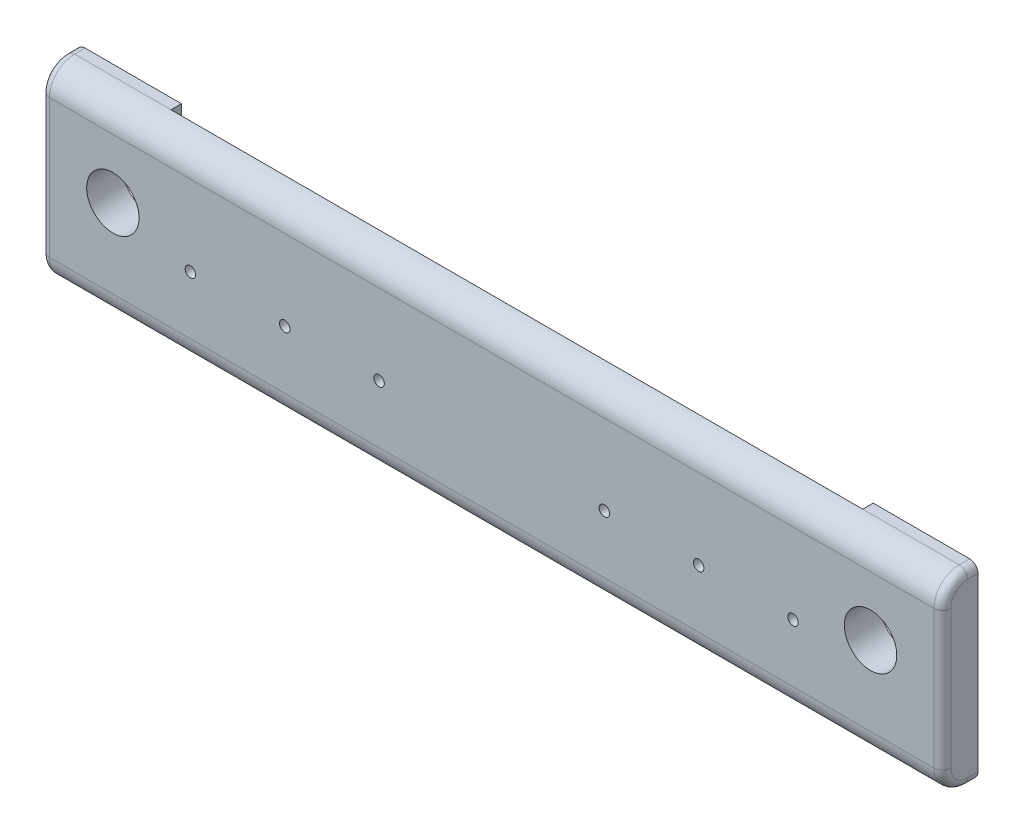
ISO-10303-21;
HEADER;
FILE_DESCRIPTION(('STEP AP214'),'2;1');
FILE_NAME('part.step','',(''),(''),'','','');
FILE_SCHEMA(('AUTOMOTIVE_DESIGN { 1 0 10303 214 1 1 1 1 }'));
ENDSEC;
DATA;
#1=APPLICATION_CONTEXT('core data for automotive mechanical design processes');
#2=APPLICATION_PROTOCOL_DEFINITION('international standard','automotive_design',2000,#1);
#3=PRODUCT_CONTEXT('',#1,'mechanical');
#4=PRODUCT('Part','Part','',(#3));
#5=PRODUCT_RELATED_PRODUCT_CATEGORY('part','',(#4));
#6=PRODUCT_DEFINITION_FORMATION('','',#4);
#7=PRODUCT_DEFINITION_CONTEXT('part definition',#1,'design');
#8=PRODUCT_DEFINITION('design','',#6,#7);
#9=PRODUCT_DEFINITION_SHAPE('','',#8);
#10=(LENGTH_UNIT() NAMED_UNIT(*) SI_UNIT(.MILLI.,.METRE.));
#11=(NAMED_UNIT(*) PLANE_ANGLE_UNIT() SI_UNIT($,.RADIAN.));
#12=(NAMED_UNIT(*) SI_UNIT($,.STERADIAN.) SOLID_ANGLE_UNIT());
#13=UNCERTAINTY_MEASURE_WITH_UNIT(LENGTH_MEASURE(1.E-05),#10,'distance_accuracy_value','');
#14=(GEOMETRIC_REPRESENTATION_CONTEXT(3) GLOBAL_UNCERTAINTY_ASSIGNED_CONTEXT((#13)) GLOBAL_UNIT_ASSIGNED_CONTEXT((#10,
#11,#12)) REPRESENTATION_CONTEXT('',''));
#15=CARTESIAN_POINT('',(0.,0.,0.));
#16=DIRECTION('',(0.,0.,1.));
#17=DIRECTION('',(1.,0.,0.));
#18=AXIS2_PLACEMENT_3D('',#15,#16,#17);
#19=CARTESIAN_POINT('',(-21.5,-4.5,1.2));
#20=DIRECTION('',(0.,1.,0.));
#21=DIRECTION('',(0.,0.,1.));
#22=AXIS2_PLACEMENT_3D('',#19,#20,#21);
#23=PLANE('',#22);
#24=DIRECTION('',(-1.,0.,0.));
#25=VECTOR('',#24,1.);
#26=CARTESIAN_POINT('',(21.5,-4.5,-0.5));
#27=LINE('',#26,#25);
#28=CARTESIAN_POINT('',(21.1,-4.5,-0.5));
#29=VERTEX_POINT('',#28);
#30=CARTESIAN_POINT('',(16.5,-4.5,-0.5));
#31=VERTEX_POINT('',#30);
#32=EDGE_CURVE('E148',#29,#31,#27,.T.);
#33=ORIENTED_EDGE('',*,*,#32,.F.);
#34=DIRECTION('',(0.,0.,-1.));
#35=VECTOR('',#34,1.);
#36=CARTESIAN_POINT('',(21.1,-4.5,1.2));
#37=LINE('',#36,#35);
#38=CARTESIAN_POINT('',(21.1,-4.5,0.));
#39=VERTEX_POINT('',#38);
#40=EDGE_CURVE('E264',#29,#39,#37,.F.);
#41=ORIENTED_EDGE('',*,*,#40,.T.);
#42=DIRECTION('',(1.,0.,0.));
#43=VECTOR('',#42,1.);
#44=CARTESIAN_POINT('',(-21.5,-4.5,0.));
#45=LINE('',#44,#43);
#46=CARTESIAN_POINT('',(16.5,-4.5,0.));
#47=VERTEX_POINT('',#46);
#48=EDGE_CURVE('E164',#39,#47,#45,.F.);
#49=ORIENTED_EDGE('',*,*,#48,.T.);
#50=DIRECTION('',(0.,0.,1.));
#51=VECTOR('',#50,1.);
#52=CARTESIAN_POINT('',(16.5,-4.5,-0.5));
#53=LINE('',#52,#51);
#54=EDGE_CURVE('E162',#31,#47,#53,.T.);
#55=ORIENTED_EDGE('',*,*,#54,.F.);
#56=EDGE_LOOP('',(#33,#41,#49,#55));
#57=FACE_BOUND('',#56,.T.);
#58=ADVANCED_FACE('F35',(#57),#23,.F.);
#59=CARTESIAN_POINT('',(-21.5,4.5,1.2));
#60=DIRECTION('',(0.,-1.,0.));
#61=DIRECTION('',(0.,0.,-1.));
#62=AXIS2_PLACEMENT_3D('',#59,#60,#61);
#63=PLANE('',#62);
#64=DIRECTION('',(1.,0.,0.));
#65=VECTOR('',#64,1.);
#66=CARTESIAN_POINT('',(-21.5,4.5,-0.5));
#67=LINE('',#66,#65);
#68=CARTESIAN_POINT('',(-21.1,4.5,-0.5));
#69=VERTEX_POINT('',#68);
#70=CARTESIAN_POINT('',(-16.5,4.5,-0.5));
#71=VERTEX_POINT('',#70);
#72=EDGE_CURVE('E185',#69,#71,#67,.T.);
#73=ORIENTED_EDGE('',*,*,#72,.F.);
#74=DIRECTION('',(0.,0.,-1.));
#75=VECTOR('',#74,1.);
#76=CARTESIAN_POINT('',(-21.1,4.5,1.2));
#77=LINE('',#76,#75);
#78=CARTESIAN_POINT('',(-21.1,4.5,0.));
#79=VERTEX_POINT('',#78);
#80=EDGE_CURVE('E228',#69,#79,#77,.F.);
#81=ORIENTED_EDGE('',*,*,#80,.T.);
#82=DIRECTION('',(-1.,0.,0.));
#83=VECTOR('',#82,1.);
#84=CARTESIAN_POINT('',(-21.5,4.5,0.));
#85=LINE('',#84,#83);
#86=CARTESIAN_POINT('',(-16.5,4.5,0.));
#87=VERTEX_POINT('',#86);
#88=EDGE_CURVE('E218',#79,#87,#85,.F.);
#89=ORIENTED_EDGE('',*,*,#88,.T.);
#90=DIRECTION('',(0.,0.,1.));
#91=VECTOR('',#90,1.);
#92=CARTESIAN_POINT('',(-16.5,4.5,-0.5));
#93=LINE('',#92,#91);
#94=EDGE_CURVE('E204',#71,#87,#93,.T.);
#95=ORIENTED_EDGE('',*,*,#94,.F.);
#96=EDGE_LOOP('',(#73,#81,#89,#95));
#97=FACE_BOUND('',#96,.T.);
#98=ADVANCED_FACE('F441',(#97),#63,.F.);
#99=CARTESIAN_POINT('',(0.,0.,0.));
#100=DIRECTION('',(0.,0.,-1.));
#101=DIRECTION('',(-1.,0.,0.));
#102=AXIS2_PLACEMENT_3D('',#99,#100,#101);
#103=PLANE('',#102);
#104=CARTESIAN_POINT('',(5.375,-0.529813205299434,0.));
#105=DIRECTION('',(0.,0.,-1.));
#106=DIRECTION('',(-1.,0.,0.));
#107=AXIS2_PLACEMENT_3D('',#104,#105,#106);
#108=CIRCLE('',#107,0.249999999999999);
#109=CARTESIAN_POINT('',(5.125,-0.529813205299434,0.));
#110=VERTEX_POINT('',#109);
#111=EDGE_CURVE('E337',#110,#110,#108,.T.);
#112=ORIENTED_EDGE('',*,*,#111,.F.);
#113=EDGE_LOOP('',(#112));
#114=FACE_BOUND('',#113,.T.);
#115=CARTESIAN_POINT('',(9.875,-0.529813205299434,0.));
#116=DIRECTION('',(0.,0.,-1.));
#117=DIRECTION('',(-1.,0.,0.));
#118=AXIS2_PLACEMENT_3D('',#115,#116,#117);
#119=CIRCLE('',#118,0.25);
#120=CARTESIAN_POINT('',(9.625,-0.529813205299434,0.));
#121=VERTEX_POINT('',#120);
#122=EDGE_CURVE('E331',#121,#121,#119,.T.);
#123=ORIENTED_EDGE('',*,*,#122,.F.);
#124=EDGE_LOOP('',(#123));
#125=FACE_BOUND('',#124,.T.);
#126=CARTESIAN_POINT('',(14.375,-0.529813205299434,0.));
#127=DIRECTION('',(0.,0.,-1.));
#128=DIRECTION('',(-1.,0.,0.));
#129=AXIS2_PLACEMENT_3D('',#126,#127,#128);
#130=CIRCLE('',#129,0.25);
#131=CARTESIAN_POINT('',(14.125,-0.529813205299434,0.));
#132=VERTEX_POINT('',#131);
#133=EDGE_CURVE('E325',#132,#132,#130,.T.);
#134=ORIENTED_EDGE('',*,*,#133,.F.);
#135=EDGE_LOOP('',(#134));
#136=FACE_BOUND('',#135,.T.);
#137=CARTESIAN_POINT('',(-5.375,-0.529813205299434,0.));
#138=DIRECTION('',(0.,0.,-1.));
#139=DIRECTION('',(-1.,0.,0.));
#140=AXIS2_PLACEMENT_3D('',#137,#138,#139);
#141=CIRCLE('',#140,0.25);
#142=CARTESIAN_POINT('',(-5.625,-0.529813205299434,0.));
#143=VERTEX_POINT('',#142);
#144=EDGE_CURVE('E319',#143,#143,#141,.T.);
#145=ORIENTED_EDGE('',*,*,#144,.F.);
#146=EDGE_LOOP('',(#145));
#147=FACE_BOUND('',#146,.T.);
#148=CARTESIAN_POINT('',(-9.875,-0.529813205299434,0.));
#149=DIRECTION('',(0.,0.,-1.));
#150=DIRECTION('',(-1.,0.,0.));
#151=AXIS2_PLACEMENT_3D('',#148,#149,#150);
#152=CIRCLE('',#151,0.25);
#153=CARTESIAN_POINT('',(-10.125,-0.529813205299434,0.));
#154=VERTEX_POINT('',#153);
#155=EDGE_CURVE('E313',#154,#154,#152,.T.);
#156=ORIENTED_EDGE('',*,*,#155,.F.);
#157=EDGE_LOOP('',(#156));
#158=FACE_BOUND('',#157,.T.);
#159=CARTESIAN_POINT('',(-14.375,-0.529813205299434,0.));
#160=DIRECTION('',(0.,0.,-1.));
#161=DIRECTION('',(-1.,0.,0.));
#162=AXIS2_PLACEMENT_3D('',#159,#160,#161);
#163=CIRCLE('',#162,0.25);
#164=CARTESIAN_POINT('',(-14.625,-0.529813205299434,0.));
#165=VERTEX_POINT('',#164);
#166=EDGE_CURVE('E275',#165,#165,#163,.T.);
#167=ORIENTED_EDGE('',*,*,#166,.F.);
#168=EDGE_LOOP('',(#167));
#169=FACE_BOUND('',#168,.T.);
#170=DIRECTION('',(-1.,0.,0.));
#171=VECTOR('',#170,1.);
#172=CARTESIAN_POINT('',(-21.5,4.5,0.));
#173=LINE('',#172,#171);
#174=CARTESIAN_POINT('',(16.5,4.5,0.));
#175=VERTEX_POINT('',#174);
#176=EDGE_CURVE('E209',#175,#87,#173,.T.);
#177=ORIENTED_EDGE('',*,*,#176,.F.);
#178=DIRECTION('',(0.,1.,0.));
#179=VECTOR('',#178,1.);
#180=CARTESIAN_POINT('',(16.5,4.5,0.));
#181=LINE('',#180,#179);
#182=EDGE_CURVE('E178',#47,#175,#181,.T.);
#183=ORIENTED_EDGE('',*,*,#182,.F.);
#184=DIRECTION('',(1.,0.,0.));
#185=VECTOR('',#184,1.);
#186=CARTESIAN_POINT('',(-21.5,-4.5,0.));
#187=LINE('',#186,#185);
#188=CARTESIAN_POINT('',(-16.5,-4.5,0.));
#189=VERTEX_POINT('',#188);
#190=EDGE_CURVE('E201',#189,#47,#187,.T.);
#191=ORIENTED_EDGE('',*,*,#190,.F.);
#192=DIRECTION('',(0.,-1.,0.));
#193=VECTOR('',#192,1.);
#194=CARTESIAN_POINT('',(-16.5,4.5,0.));
#195=LINE('',#194,#193);
#196=EDGE_CURVE('E168',#87,#189,#195,.T.);
#197=ORIENTED_EDGE('',*,*,#196,.F.);
#198=EDGE_LOOP('',(#177,#183,#191,#197));
#199=FACE_BOUND('',#198,.T.);
#200=ADVANCED_FACE('F426',(#114,#125,#136,#147,#158,#169,#199),#103,.T.);
#201=CARTESIAN_POINT('',(21.5,-4.5,1.2));
#202=DIRECTION('',(-1.,0.,0.));
#203=DIRECTION('',(0.,0.,1.));
#204=AXIS2_PLACEMENT_3D('',#201,#202,#203);
#205=PLANE('',#204);
#206=CARTESIAN_POINT('',(21.5,-3.3,0.));
#207=DIRECTION('',(-1.,0.,0.));
#208=DIRECTION('',(0.,0.,1.));
#209=AXIS2_PLACEMENT_3D('',#206,#207,#208);
#210=CIRCLE('',#209,0.8);
#211=CARTESIAN_POINT('',(21.5,-3.3,0.8));
#212=VERTEX_POINT('',#211);
#213=CARTESIAN_POINT('',(21.5,-4.1,0.));
#214=VERTEX_POINT('',#213);
#215=EDGE_CURVE('E256',#212,#214,#210,.F.);
#216=ORIENTED_EDGE('',*,*,#215,.T.);
#217=DIRECTION('',(0.,0.,-1.));
#218=VECTOR('',#217,1.);
#219=CARTESIAN_POINT('',(21.5,-4.1,1.2));
#220=LINE('',#219,#218);
#221=CARTESIAN_POINT('',(21.5,-4.1,-0.5));
#222=VERTEX_POINT('',#221);
#223=EDGE_CURVE('E258',#214,#222,#220,.T.);
#224=ORIENTED_EDGE('',*,*,#223,.T.);
#225=DIRECTION('',(0.,-1.,0.));
#226=VECTOR('',#225,1.);
#227=CARTESIAN_POINT('',(21.5,4.5,-0.5));
#228=LINE('',#227,#226);
#229=CARTESIAN_POINT('',(21.5,4.1,-0.5));
#230=VERTEX_POINT('',#229);
#231=EDGE_CURVE('E159',#230,#222,#228,.T.);
#232=ORIENTED_EDGE('',*,*,#231,.F.);
#233=DIRECTION('',(0.,0.,-1.));
#234=VECTOR('',#233,1.);
#235=CARTESIAN_POINT('',(21.5,4.1,1.2));
#236=LINE('',#235,#234);
#237=CARTESIAN_POINT('',(21.5,4.1,0.));
#238=VERTEX_POINT('',#237);
#239=EDGE_CURVE('E254',#230,#238,#236,.F.);
#240=ORIENTED_EDGE('',*,*,#239,.T.);
#241=CARTESIAN_POINT('',(21.5,3.3,0.));
#242=DIRECTION('',(-1.,0.,0.));
#243=DIRECTION('',(0.,0.,1.));
#244=AXIS2_PLACEMENT_3D('',#241,#242,#243);
#245=CIRCLE('',#244,0.8);
#246=CARTESIAN_POINT('',(21.5,3.3,0.8));
#247=VERTEX_POINT('',#246);
#248=EDGE_CURVE('E252',#238,#247,#245,.F.);
#249=ORIENTED_EDGE('',*,*,#248,.T.);
#250=DIRECTION('',(0.,1.,0.));
#251=VECTOR('',#250,1.);
#252=CARTESIAN_POINT('',(21.5,-4.5,0.8));
#253=LINE('',#252,#251);
#254=EDGE_CURVE('E237',#247,#212,#253,.F.);
#255=ORIENTED_EDGE('',*,*,#254,.T.);
#256=EDGE_LOOP('',(#216,#224,#232,#240,#249,#255));
#257=FACE_BOUND('',#256,.T.);
#258=ADVANCED_FACE('F295',(#257),#205,.F.);
#259=DIRECTION('',(-1.,0.,0.));
#260=VECTOR('',#259,1.);
#261=CARTESIAN_POINT('',(-21.5,4.5,0.));
#262=LINE('',#261,#260);
#263=CARTESIAN_POINT('',(21.1,4.5,0.));
#264=VERTEX_POINT('',#263);
#265=EDGE_CURVE('E216',#175,#264,#262,.F.);
#266=ORIENTED_EDGE('',*,*,#265,.T.);
#267=DIRECTION('',(0.,0.,-1.));
#268=VECTOR('',#267,1.);
#269=CARTESIAN_POINT('',(21.1,4.5,1.2));
#270=LINE('',#269,#268);
#271=CARTESIAN_POINT('',(21.1,4.5,-0.5));
#272=VERTEX_POINT('',#271);
#273=EDGE_CURVE('E268',#264,#272,#270,.T.);
#274=ORIENTED_EDGE('',*,*,#273,.T.);
#275=DIRECTION('',(1.,0.,0.));
#276=VECTOR('',#275,1.);
#277=CARTESIAN_POINT('',(21.5,4.5,-0.5));
#278=LINE('',#277,#276);
#279=CARTESIAN_POINT('',(16.5,4.5,-0.5));
#280=VERTEX_POINT('',#279);
#281=EDGE_CURVE('E173',#280,#272,#278,.T.);
#282=ORIENTED_EDGE('',*,*,#281,.F.);
#283=DIRECTION('',(0.,0.,1.));
#284=VECTOR('',#283,1.);
#285=CARTESIAN_POINT('',(16.5,4.5,-0.5));
#286=LINE('',#285,#284);
#287=EDGE_CURVE('E169',#280,#175,#286,.T.);
#288=ORIENTED_EDGE('',*,*,#287,.T.);
#289=EDGE_LOOP('',(#266,#274,#282,#288));
#290=FACE_BOUND('',#289,.T.);
#291=ADVANCED_FACE('F292',(#290),#63,.F.);
#292=CARTESIAN_POINT('',(-21.5,-4.5,1.2));
#293=DIRECTION('',(1.,0.,0.));
#294=DIRECTION('',(0.,0.,-1.));
#295=AXIS2_PLACEMENT_3D('',#292,#293,#294);
#296=PLANE('',#295);
#297=DIRECTION('',(0.,1.,0.));
#298=VECTOR('',#297,1.);
#299=CARTESIAN_POINT('',(-21.5,4.5,-0.5));
#300=LINE('',#299,#298);
#301=CARTESIAN_POINT('',(-21.5,-4.1,-0.5));
#302=VERTEX_POINT('',#301);
#303=CARTESIAN_POINT('',(-21.5,4.1,-0.5));
#304=VERTEX_POINT('',#303);
#305=EDGE_CURVE('E182',#302,#304,#300,.T.);
#306=ORIENTED_EDGE('',*,*,#305,.F.);
#307=DIRECTION('',(0.,0.,-1.));
#308=VECTOR('',#307,1.);
#309=CARTESIAN_POINT('',(-21.5,-4.1,1.2));
#310=LINE('',#309,#308);
#311=CARTESIAN_POINT('',(-21.5,-4.1,0.));
#312=VERTEX_POINT('',#311);
#313=EDGE_CURVE('E226',#302,#312,#310,.F.);
#314=ORIENTED_EDGE('',*,*,#313,.T.);
#315=CARTESIAN_POINT('',(-21.5,-3.3,0.));
#316=DIRECTION('',(1.,0.,0.));
#317=DIRECTION('',(0.,0.,-1.));
#318=AXIS2_PLACEMENT_3D('',#315,#316,#317);
#319=CIRCLE('',#318,0.8);
#320=CARTESIAN_POINT('',(-21.5,-3.3,0.8));
#321=VERTEX_POINT('',#320);
#322=EDGE_CURVE('E394',#312,#321,#319,.F.);
#323=ORIENTED_EDGE('',*,*,#322,.T.);
#324=DIRECTION('',(0.,-1.,0.));
#325=VECTOR('',#324,1.);
#326=CARTESIAN_POINT('',(-21.5,-4.5,0.8));
#327=LINE('',#326,#325);
#328=CARTESIAN_POINT('',(-21.5,3.3,0.8));
#329=VERTEX_POINT('',#328);
#330=EDGE_CURVE('E396',#321,#329,#327,.F.);
#331=ORIENTED_EDGE('',*,*,#330,.T.);
#332=CARTESIAN_POINT('',(-21.5,3.3,0.));
#333=DIRECTION('',(1.,0.,0.));
#334=DIRECTION('',(0.,0.,-1.));
#335=AXIS2_PLACEMENT_3D('',#332,#333,#334);
#336=CIRCLE('',#335,0.8);
#337=CARTESIAN_POINT('',(-21.5,4.1,0.));
#338=VERTEX_POINT('',#337);
#339=EDGE_CURVE('E398',#329,#338,#336,.F.);
#340=ORIENTED_EDGE('',*,*,#339,.T.);
#341=DIRECTION('',(0.,0.,-1.));
#342=VECTOR('',#341,1.);
#343=CARTESIAN_POINT('',(-21.5,4.1,1.2));
#344=LINE('',#343,#342);
#345=EDGE_CURVE('E399',#338,#304,#344,.T.);
#346=ORIENTED_EDGE('',*,*,#345,.T.);
#347=EDGE_LOOP('',(#306,#314,#323,#331,#340,#346));
#348=FACE_BOUND('',#347,.T.);
#349=ADVANCED_FACE('F405',(#348),#296,.F.);
#350=DIRECTION('',(1.,0.,0.));
#351=VECTOR('',#350,1.);
#352=CARTESIAN_POINT('',(-21.5,-4.5,0.));
#353=LINE('',#352,#351);
#354=CARTESIAN_POINT('',(-21.1,-4.5,0.));
#355=VERTEX_POINT('',#354);
#356=EDGE_CURVE('E369',#189,#355,#353,.F.);
#357=ORIENTED_EDGE('',*,*,#356,.T.);
#358=DIRECTION('',(0.,0.,-1.));
#359=VECTOR('',#358,1.);
#360=CARTESIAN_POINT('',(-21.1,-4.5,1.2));
#361=LINE('',#360,#359);
#362=CARTESIAN_POINT('',(-21.1,-4.5,-0.5));
#363=VERTEX_POINT('',#362);
#364=EDGE_CURVE('E382',#355,#363,#361,.T.);
#365=ORIENTED_EDGE('',*,*,#364,.T.);
#366=DIRECTION('',(-1.,0.,0.));
#367=VECTOR('',#366,1.);
#368=CARTESIAN_POINT('',(-21.5,-4.5,-0.5));
#369=LINE('',#368,#367);
#370=CARTESIAN_POINT('',(-16.5,-4.5,-0.5));
#371=VERTEX_POINT('',#370);
#372=EDGE_CURVE('E189',#371,#363,#369,.T.);
#373=ORIENTED_EDGE('',*,*,#372,.F.);
#374=DIRECTION('',(0.,0.,1.));
#375=VECTOR('',#374,1.);
#376=CARTESIAN_POINT('',(-16.5,-4.5,-0.5));
#377=LINE('',#376,#375);
#378=EDGE_CURVE('E192',#371,#189,#377,.T.);
#379=ORIENTED_EDGE('',*,*,#378,.T.);
#380=EDGE_LOOP('',(#357,#365,#373,#379));
#381=FACE_BOUND('',#380,.T.);
#382=ADVANCED_FACE('F350',(#381),#23,.F.);
#383=CARTESIAN_POINT('',(0.,0.,1.2));
#384=DIRECTION('',(0.,0.,-1.));
#385=DIRECTION('',(-1.,0.,0.));
#386=AXIS2_PLACEMENT_3D('',#383,#384,#385);
#387=PLANE('',#386);
#388=CARTESIAN_POINT('',(5.375,-0.529813205299434,1.2));
#389=DIRECTION('',(0.,0.,1.));
#390=DIRECTION('',(1.,0.,0.));
#391=AXIS2_PLACEMENT_3D('',#388,#389,#390);
#392=CIRCLE('',#391,0.249999999999999);
#393=CARTESIAN_POINT('',(5.625,-0.529813205299434,1.2));
#394=VERTEX_POINT('',#393);
#395=EDGE_CURVE('E340',#394,#394,#392,.T.);
#396=ORIENTED_EDGE('',*,*,#395,.F.);
#397=EDGE_LOOP('',(#396));
#398=FACE_BOUND('',#397,.T.);
#399=CARTESIAN_POINT('',(9.875,-0.529813205299434,1.2));
#400=DIRECTION('',(0.,0.,1.));
#401=DIRECTION('',(1.,0.,0.));
#402=AXIS2_PLACEMENT_3D('',#399,#400,#401);
#403=CIRCLE('',#402,0.25);
#404=CARTESIAN_POINT('',(10.125,-0.529813205299434,1.2));
#405=VERTEX_POINT('',#404);
#406=EDGE_CURVE('E334',#405,#405,#403,.T.);
#407=ORIENTED_EDGE('',*,*,#406,.F.);
#408=EDGE_LOOP('',(#407));
#409=FACE_BOUND('',#408,.T.);
#410=CARTESIAN_POINT('',(14.375,-0.529813205299434,1.2));
#411=DIRECTION('',(0.,0.,1.));
#412=DIRECTION('',(1.,0.,0.));
#413=AXIS2_PLACEMENT_3D('',#410,#411,#412);
#414=CIRCLE('',#413,0.25);
#415=CARTESIAN_POINT('',(14.625,-0.529813205299434,1.2));
#416=VERTEX_POINT('',#415);
#417=EDGE_CURVE('E328',#416,#416,#414,.T.);
#418=ORIENTED_EDGE('',*,*,#417,.F.);
#419=EDGE_LOOP('',(#418));
#420=FACE_BOUND('',#419,.T.);
#421=CARTESIAN_POINT('',(-5.375,-0.529813205299434,1.2));
#422=DIRECTION('',(0.,0.,1.));
#423=DIRECTION('',(1.,0.,0.));
#424=AXIS2_PLACEMENT_3D('',#421,#422,#423);
#425=CIRCLE('',#424,0.25);
#426=CARTESIAN_POINT('',(-5.125,-0.529813205299434,1.2));
#427=VERTEX_POINT('',#426);
#428=EDGE_CURVE('E322',#427,#427,#425,.T.);
#429=ORIENTED_EDGE('',*,*,#428,.F.);
#430=EDGE_LOOP('',(#429));
#431=FACE_BOUND('',#430,.T.);
#432=CARTESIAN_POINT('',(-9.875,-0.529813205299434,1.2));
#433=DIRECTION('',(0.,0.,1.));
#434=DIRECTION('',(1.,0.,0.));
#435=AXIS2_PLACEMENT_3D('',#432,#433,#434);
#436=CIRCLE('',#435,0.25);
#437=CARTESIAN_POINT('',(-9.625,-0.529813205299434,1.2));
#438=VERTEX_POINT('',#437);
#439=EDGE_CURVE('E316',#438,#438,#436,.T.);
#440=ORIENTED_EDGE('',*,*,#439,.F.);
#441=EDGE_LOOP('',(#440));
#442=FACE_BOUND('',#441,.T.);
#443=CARTESIAN_POINT('',(-14.375,-0.529813205299434,1.2));
#444=DIRECTION('',(0.,0.,1.));
#445=DIRECTION('',(1.,0.,0.));
#446=AXIS2_PLACEMENT_3D('',#443,#444,#445);
#447=CIRCLE('',#446,0.25);
#448=CARTESIAN_POINT('',(-14.125,-0.529813205299434,1.2));
#449=VERTEX_POINT('',#448);
#450=EDGE_CURVE('E310',#449,#449,#447,.T.);
#451=ORIENTED_EDGE('',*,*,#450,.F.);
#452=EDGE_LOOP('',(#451));
#453=FACE_BOUND('',#452,.T.);
#454=CARTESIAN_POINT('',(-18.075,0.470186794700567,1.2));
#455=DIRECTION('',(0.,0.,-1.));
#456=DIRECTION('',(-1.,0.,0.));
#457=AXIS2_PLACEMENT_3D('',#454,#455,#456);
#458=CIRCLE('',#457,1.25);
#459=CARTESIAN_POINT('',(-19.325,0.470186794700567,1.2));
#460=VERTEX_POINT('',#459);
#461=EDGE_CURVE('E303',#460,#460,#458,.T.);
#462=ORIENTED_EDGE('',*,*,#461,.T.);
#463=EDGE_LOOP('',(#462));
#464=FACE_BOUND('',#463,.T.);
#465=CARTESIAN_POINT('',(18.075,0.470186794700567,1.2));
#466=DIRECTION('',(0.,0.,-1.));
#467=DIRECTION('',(-1.,0.,0.));
#468=AXIS2_PLACEMENT_3D('',#465,#466,#467);
#469=CIRCLE('',#468,1.25);
#470=CARTESIAN_POINT('',(16.825,0.470186794700567,1.2));
#471=VERTEX_POINT('',#470);
#472=EDGE_CURVE('E180',#471,#471,#469,.T.);
#473=ORIENTED_EDGE('',*,*,#472,.T.);
#474=EDGE_LOOP('',(#473));
#475=FACE_BOUND('',#474,.T.);
#476=DIRECTION('',(1.,0.,0.));
#477=VECTOR('',#476,1.);
#478=CARTESIAN_POINT('',(0.,-3.3,1.2));
#479=LINE('',#478,#477);
#480=CARTESIAN_POINT('',(-21.1,-3.3,1.2));
#481=VERTEX_POINT('',#480);
#482=CARTESIAN_POINT('',(21.1,-3.3,1.2));
#483=VERTEX_POINT('',#482);
#484=EDGE_CURVE('E221',#481,#483,#479,.T.);
#485=ORIENTED_EDGE('',*,*,#484,.T.);
#486=DIRECTION('',(0.,1.,0.));
#487=VECTOR('',#486,1.);
#488=CARTESIAN_POINT('',(21.1,0.,1.2));
#489=LINE('',#488,#487);
#490=CARTESIAN_POINT('',(21.1,3.3,1.2));
#491=VERTEX_POINT('',#490);
#492=EDGE_CURVE('E11',#483,#491,#489,.T.);
#493=ORIENTED_EDGE('',*,*,#492,.T.);
#494=DIRECTION('',(-1.,0.,0.));
#495=VECTOR('',#494,1.);
#496=CARTESIAN_POINT('',(0.,3.3,1.2));
#497=LINE('',#496,#495);
#498=CARTESIAN_POINT('',(-21.1,3.3,1.2));
#499=VERTEX_POINT('',#498);
#500=EDGE_CURVE('E214',#491,#499,#497,.T.);
#501=ORIENTED_EDGE('',*,*,#500,.T.);
#502=DIRECTION('',(0.,-1.,0.));
#503=VECTOR('',#502,1.);
#504=CARTESIAN_POINT('',(-21.1,0.,1.2));
#505=LINE('',#504,#503);
#506=EDGE_CURVE('E233',#499,#481,#505,.T.);
#507=ORIENTED_EDGE('',*,*,#506,.T.);
#508=EDGE_LOOP('',(#485,#493,#501,#507));
#509=FACE_BOUND('',#508,.T.);
#510=ADVANCED_FACE('F346',(#398,#409,#420,#431,#442,#453,#464,#475,#509),#387,.F.);
#511=CARTESIAN_POINT('',(-16.5,4.5,-0.5));
#512=DIRECTION('',(-1.,0.,0.));
#513=DIRECTION('',(0.,0.,1.));
#514=AXIS2_PLACEMENT_3D('',#511,#512,#513);
#515=PLANE('',#514);
#516=ORIENTED_EDGE('',*,*,#196,.T.);
#517=ORIENTED_EDGE('',*,*,#378,.F.);
#518=DIRECTION('',(0.,-1.,0.));
#519=VECTOR('',#518,1.);
#520=CARTESIAN_POINT('',(-16.5,4.5,-0.5));
#521=LINE('',#520,#519);
#522=EDGE_CURVE('E187',#71,#371,#521,.T.);
#523=ORIENTED_EDGE('',*,*,#522,.F.);
#524=ORIENTED_EDGE('',*,*,#94,.T.);
#525=EDGE_LOOP('',(#516,#517,#523,#524));
#526=FACE_BOUND('',#525,.T.);
#527=ADVANCED_FACE('F349',(#526),#515,.F.);
#528=CARTESIAN_POINT('',(0.,0.,-0.5));
#529=DIRECTION('',(0.,0.,1.));
#530=DIRECTION('',(1.,0.,0.));
#531=AXIS2_PLACEMENT_3D('',#528,#529,#530);
#532=PLANE('',#531);
#533=CARTESIAN_POINT('',(-18.075,0.470186794700567,-0.5));
#534=DIRECTION('',(0.,0.,-1.));
#535=DIRECTION('',(-1.,0.,0.));
#536=AXIS2_PLACEMENT_3D('',#533,#534,#535);
#537=CIRCLE('',#536,1.25);
#538=CARTESIAN_POINT('',(-19.325,0.470186794700567,-0.5));
#539=VERTEX_POINT('',#538);
#540=EDGE_CURVE('E250',#539,#539,#537,.T.);
#541=ORIENTED_EDGE('',*,*,#540,.F.);
#542=EDGE_LOOP('',(#541));
#543=FACE_BOUND('',#542,.T.);
#544=ORIENTED_EDGE('',*,*,#372,.T.);
#545=CARTESIAN_POINT('',(-21.1,-4.1,-0.5));
#546=DIRECTION('',(0.,0.,1.));
#547=DIRECTION('',(1.,0.,0.));
#548=AXIS2_PLACEMENT_3D('',#545,#546,#547);
#549=CIRCLE('',#548,0.4);
#550=EDGE_CURVE('E392',#363,#302,#549,.F.);
#551=ORIENTED_EDGE('',*,*,#550,.T.);
#552=ORIENTED_EDGE('',*,*,#305,.T.);
#553=CARTESIAN_POINT('',(-21.1,4.1,-0.5));
#554=DIRECTION('',(0.,0.,1.));
#555=DIRECTION('',(1.,0.,0.));
#556=AXIS2_PLACEMENT_3D('',#553,#554,#555);
#557=CIRCLE('',#556,0.4);
#558=EDGE_CURVE('E385',#304,#69,#557,.F.);
#559=ORIENTED_EDGE('',*,*,#558,.T.);
#560=ORIENTED_EDGE('',*,*,#72,.T.);
#561=ORIENTED_EDGE('',*,*,#522,.T.);
#562=EDGE_LOOP('',(#544,#551,#552,#559,#560,#561));
#563=FACE_BOUND('',#562,.T.);
#564=ADVANCED_FACE('F417',(#543,#563),#532,.F.);
#565=CARTESIAN_POINT('',(16.5,4.5,-0.5));
#566=DIRECTION('',(1.,0.,0.));
#567=DIRECTION('',(0.,1.,0.));
#568=AXIS2_PLACEMENT_3D('',#565,#566,#567);
#569=PLANE('',#568);
#570=ORIENTED_EDGE('',*,*,#182,.T.);
#571=ORIENTED_EDGE('',*,*,#287,.F.);
#572=DIRECTION('',(0.,1.,0.));
#573=VECTOR('',#572,1.);
#574=CARTESIAN_POINT('',(16.5,4.5,-0.5));
#575=LINE('',#574,#573);
#576=EDGE_CURVE('E154',#31,#280,#575,.T.);
#577=ORIENTED_EDGE('',*,*,#576,.F.);
#578=ORIENTED_EDGE('',*,*,#54,.T.);
#579=EDGE_LOOP('',(#570,#571,#577,#578));
#580=FACE_BOUND('',#579,.T.);
#581=ADVANCED_FACE('F171',(#580),#569,.F.);
#582=CARTESIAN_POINT('',(0.,0.,-0.5));
#583=DIRECTION('',(0.,0.,-1.));
#584=DIRECTION('',(-1.,0.,0.));
#585=AXIS2_PLACEMENT_3D('',#582,#583,#584);
#586=PLANE('',#585);
#587=CARTESIAN_POINT('',(18.075,0.470186794700567,-0.5));
#588=DIRECTION('',(0.,0.,-1.));
#589=DIRECTION('',(-1.,0.,0.));
#590=AXIS2_PLACEMENT_3D('',#587,#588,#589);
#591=CIRCLE('',#590,1.25);
#592=CARTESIAN_POINT('',(16.825,0.470186794700567,-0.5));
#593=VERTEX_POINT('',#592);
#594=EDGE_CURVE('E300',#593,#593,#591,.T.);
#595=ORIENTED_EDGE('',*,*,#594,.F.);
#596=EDGE_LOOP('',(#595));
#597=FACE_BOUND('',#596,.T.);
#598=ORIENTED_EDGE('',*,*,#231,.T.);
#599=CARTESIAN_POINT('',(21.1,-4.1,-0.5));
#600=DIRECTION('',(0.,0.,-1.));
#601=DIRECTION('',(-1.,0.,0.));
#602=AXIS2_PLACEMENT_3D('',#599,#600,#601);
#603=CIRCLE('',#602,0.4);
#604=EDGE_CURVE('E156',#222,#29,#603,.T.);
#605=ORIENTED_EDGE('',*,*,#604,.T.);
#606=ORIENTED_EDGE('',*,*,#32,.T.);
#607=ORIENTED_EDGE('',*,*,#576,.T.);
#608=ORIENTED_EDGE('',*,*,#281,.T.);
#609=CARTESIAN_POINT('',(21.1,4.1,-0.5));
#610=DIRECTION('',(0.,0.,-1.));
#611=DIRECTION('',(-1.,0.,0.));
#612=AXIS2_PLACEMENT_3D('',#609,#610,#611);
#613=CIRCLE('',#612,0.4);
#614=EDGE_CURVE('E261',#272,#230,#613,.T.);
#615=ORIENTED_EDGE('',*,*,#614,.T.);
#616=EDGE_LOOP('',(#598,#605,#606,#607,#608,#615));
#617=FACE_BOUND('',#616,.T.);
#618=ADVANCED_FACE('F151',(#597,#617),#586,.T.);
#619=CARTESIAN_POINT('',(0.,3.3,0.));
#620=DIRECTION('',(-1.,0.,0.));
#621=DIRECTION('',(0.,0.,1.));
#622=AXIS2_PLACEMENT_3D('',#619,#620,#621);
#623=CYLINDRICAL_SURFACE('',#622,1.2);
#624=ORIENTED_EDGE('',*,*,#500,.F.);
#625=CARTESIAN_POINT('',(21.1,3.3,0.));
#626=DIRECTION('',(-1.,0.,0.));
#627=DIRECTION('',(0.,0.,1.));
#628=AXIS2_PLACEMENT_3D('',#625,#626,#627);
#629=CIRCLE('',#628,1.2);
#630=EDGE_CURVE('E44',#491,#264,#629,.T.);
#631=ORIENTED_EDGE('',*,*,#630,.T.);
#632=ORIENTED_EDGE('',*,*,#265,.F.);
#633=ORIENTED_EDGE('',*,*,#176,.T.);
#634=ORIENTED_EDGE('',*,*,#88,.F.);
#635=CARTESIAN_POINT('',(-21.1,3.3,0.));
#636=DIRECTION('',(1.,0.,0.));
#637=DIRECTION('',(0.,0.,-1.));
#638=AXIS2_PLACEMENT_3D('',#635,#636,#637);
#639=CIRCLE('',#638,1.2);
#640=EDGE_CURVE('E230',#79,#499,#639,.T.);
#641=ORIENTED_EDGE('',*,*,#640,.T.);
#642=EDGE_LOOP('',(#624,#631,#632,#633,#634,#641));
#643=FACE_BOUND('',#642,.T.);
#644=ADVANCED_FACE('F428',(#643),#623,.T.);
#645=CARTESIAN_POINT('',(0.,-3.3,0.));
#646=DIRECTION('',(1.,0.,0.));
#647=DIRECTION('',(0.,0.,-1.));
#648=AXIS2_PLACEMENT_3D('',#645,#646,#647);
#649=CYLINDRICAL_SURFACE('',#648,1.2);
#650=ORIENTED_EDGE('',*,*,#48,.F.);
#651=CARTESIAN_POINT('',(21.1,-3.3,0.));
#652=DIRECTION('',(-1.,0.,0.));
#653=DIRECTION('',(0.,0.,1.));
#654=AXIS2_PLACEMENT_3D('',#651,#652,#653);
#655=CIRCLE('',#654,1.2);
#656=EDGE_CURVE('E266',#39,#483,#655,.T.);
#657=ORIENTED_EDGE('',*,*,#656,.T.);
#658=ORIENTED_EDGE('',*,*,#484,.F.);
#659=CARTESIAN_POINT('',(-21.1,-3.3,0.));
#660=DIRECTION('',(1.,0.,0.));
#661=DIRECTION('',(0.,0.,-1.));
#662=AXIS2_PLACEMENT_3D('',#659,#660,#661);
#663=CIRCLE('',#662,1.2);
#664=EDGE_CURVE('E235',#481,#355,#663,.T.);
#665=ORIENTED_EDGE('',*,*,#664,.T.);
#666=ORIENTED_EDGE('',*,*,#356,.F.);
#667=ORIENTED_EDGE('',*,*,#190,.T.);
#668=EDGE_LOOP('',(#650,#657,#658,#665,#666,#667));
#669=FACE_BOUND('',#668,.T.);
#670=ADVANCED_FACE('F380',(#669),#649,.T.);
#671=CARTESIAN_POINT('',(18.075,0.470186794700567,5.));
#672=DIRECTION('',(0.,0.,-1.));
#673=DIRECTION('',(-1.,0.,0.));
#674=AXIS2_PLACEMENT_3D('',#671,#672,#673);
#675=CYLINDRICAL_SURFACE('',#674,1.25);
#676=ORIENTED_EDGE('',*,*,#594,.T.);
#677=EDGE_LOOP('',(#676));
#678=FACE_BOUND('',#677,.T.);
#679=ORIENTED_EDGE('',*,*,#472,.F.);
#680=EDGE_LOOP('',(#679));
#681=FACE_BOUND('',#680,.T.);
#682=ADVANCED_FACE('F435',(#678,#681),#675,.F.);
#683=CARTESIAN_POINT('',(-18.075,0.470186794700567,5.));
#684=DIRECTION('',(0.,0.,-1.));
#685=DIRECTION('',(-1.,0.,0.));
#686=AXIS2_PLACEMENT_3D('',#683,#684,#685);
#687=CYLINDRICAL_SURFACE('',#686,1.25);
#688=ORIENTED_EDGE('',*,*,#540,.T.);
#689=EDGE_LOOP('',(#688));
#690=FACE_BOUND('',#689,.T.);
#691=ORIENTED_EDGE('',*,*,#461,.F.);
#692=EDGE_LOOP('',(#691));
#693=FACE_BOUND('',#692,.T.);
#694=ADVANCED_FACE('F476',(#690,#693),#687,.F.);
#695=CARTESIAN_POINT('',(-21.1,4.1,1.2));
#696=DIRECTION('',(0.,0.,-1.));
#697=DIRECTION('',(-1.,0.,0.));
#698=AXIS2_PLACEMENT_3D('',#695,#696,#697);
#699=CYLINDRICAL_SURFACE('',#698,0.4);
#700=ORIENTED_EDGE('',*,*,#558,.F.);
#701=ORIENTED_EDGE('',*,*,#345,.F.);
#702=CARTESIAN_POINT('',(-21.1,4.1,0.));
#703=DIRECTION('',(0.,0.,1.));
#704=DIRECTION('',(1.,0.,0.));
#705=AXIS2_PLACEMENT_3D('',#702,#703,#704);
#706=CIRCLE('',#705,0.4);
#707=EDGE_CURVE('E247',#79,#338,#706,.T.);
#708=ORIENTED_EDGE('',*,*,#707,.F.);
#709=ORIENTED_EDGE('',*,*,#80,.F.);
#710=EDGE_LOOP('',(#700,#701,#708,#709));
#711=FACE_BOUND('',#710,.T.);
#712=ADVANCED_FACE('F480',(#711),#699,.T.);
#713=CARTESIAN_POINT('',(-21.1,3.3,0.));
#714=DIRECTION('',(1.,0.,0.));
#715=DIRECTION('',(0.,0.,-1.));
#716=AXIS2_PLACEMENT_3D('',#713,#714,#715);
#717=TOROIDAL_SURFACE('',#716,0.8,0.4);
#718=ORIENTED_EDGE('',*,*,#707,.T.);
#719=ORIENTED_EDGE('',*,*,#339,.F.);
#720=CARTESIAN_POINT('',(-21.1,3.3,0.8));
#721=DIRECTION('',(0.,-1.,0.));
#722=DIRECTION('',(0.,0.,-1.));
#723=AXIS2_PLACEMENT_3D('',#720,#721,#722);
#724=CIRCLE('',#723,0.4);
#725=EDGE_CURVE('E244',#499,#329,#724,.T.);
#726=ORIENTED_EDGE('',*,*,#725,.F.);
#727=ORIENTED_EDGE('',*,*,#640,.F.);
#728=EDGE_LOOP('',(#718,#719,#726,#727));
#729=FACE_BOUND('',#728,.T.);
#730=ADVANCED_FACE('F575',(#729),#717,.T.);
#731=CARTESIAN_POINT('',(-21.1,0.,0.8));
#732=DIRECTION('',(0.,-1.,0.));
#733=DIRECTION('',(0.,0.,-1.));
#734=AXIS2_PLACEMENT_3D('',#731,#732,#733);
#735=CYLINDRICAL_SURFACE('',#734,0.4);
#736=ORIENTED_EDGE('',*,*,#725,.T.);
#737=ORIENTED_EDGE('',*,*,#330,.F.);
#738=CARTESIAN_POINT('',(-21.1,-3.3,0.8));
#739=DIRECTION('',(0.,-1.,0.));
#740=DIRECTION('',(0.,0.,-1.));
#741=AXIS2_PLACEMENT_3D('',#738,#739,#740);
#742=CIRCLE('',#741,0.4);
#743=EDGE_CURVE('E241',#481,#321,#742,.T.);
#744=ORIENTED_EDGE('',*,*,#743,.F.);
#745=ORIENTED_EDGE('',*,*,#506,.F.);
#746=EDGE_LOOP('',(#736,#737,#744,#745));
#747=FACE_BOUND('',#746,.T.);
#748=ADVANCED_FACE('F568',(#747),#735,.T.);
#749=CARTESIAN_POINT('',(-21.1,-3.3,0.));
#750=DIRECTION('',(1.,0.,0.));
#751=DIRECTION('',(0.,0.,-1.));
#752=AXIS2_PLACEMENT_3D('',#749,#750,#751);
#753=TOROIDAL_SURFACE('',#752,0.8,0.4);
#754=ORIENTED_EDGE('',*,*,#743,.T.);
#755=ORIENTED_EDGE('',*,*,#322,.F.);
#756=CARTESIAN_POINT('',(-21.1,-4.1,0.));
#757=DIRECTION('',(0.,0.,-1.));
#758=DIRECTION('',(-1.,0.,0.));
#759=AXIS2_PLACEMENT_3D('',#756,#757,#758);
#760=CIRCLE('',#759,0.4);
#761=EDGE_CURVE('E238',#355,#312,#760,.T.);
#762=ORIENTED_EDGE('',*,*,#761,.F.);
#763=ORIENTED_EDGE('',*,*,#664,.F.);
#764=EDGE_LOOP('',(#754,#755,#762,#763));
#765=FACE_BOUND('',#764,.T.);
#766=ADVANCED_FACE('F410',(#765),#753,.T.);
#767=CARTESIAN_POINT('',(-21.1,-4.1,1.2));
#768=DIRECTION('',(0.,0.,-1.));
#769=DIRECTION('',(-1.,0.,0.));
#770=AXIS2_PLACEMENT_3D('',#767,#768,#769);
#771=CYLINDRICAL_SURFACE('',#770,0.4);
#772=ORIENTED_EDGE('',*,*,#761,.T.);
#773=ORIENTED_EDGE('',*,*,#313,.F.);
#774=ORIENTED_EDGE('',*,*,#550,.F.);
#775=ORIENTED_EDGE('',*,*,#364,.F.);
#776=EDGE_LOOP('',(#772,#773,#774,#775));
#777=FACE_BOUND('',#776,.T.);
#778=ADVANCED_FACE('F413',(#777),#771,.T.);
#779=CARTESIAN_POINT('',(21.1,4.1,1.2));
#780=DIRECTION('',(0.,0.,-1.));
#781=DIRECTION('',(-1.,0.,0.));
#782=AXIS2_PLACEMENT_3D('',#779,#780,#781);
#783=CYLINDRICAL_SURFACE('',#782,0.4);
#784=ORIENTED_EDGE('',*,*,#614,.F.);
#785=ORIENTED_EDGE('',*,*,#273,.F.);
#786=CARTESIAN_POINT('',(21.1,4.1,0.));
#787=DIRECTION('',(0.,0.,1.));
#788=DIRECTION('',(1.,0.,0.));
#789=AXIS2_PLACEMENT_3D('',#786,#787,#788);
#790=CIRCLE('',#789,0.4);
#791=EDGE_CURVE('E39',#238,#264,#790,.T.);
#792=ORIENTED_EDGE('',*,*,#791,.F.);
#793=ORIENTED_EDGE('',*,*,#239,.F.);
#794=EDGE_LOOP('',(#784,#785,#792,#793));
#795=FACE_BOUND('',#794,.T.);
#796=ADVANCED_FACE('F37',(#795),#783,.T.);
#797=CARTESIAN_POINT('',(21.1,3.3,0.));
#798=DIRECTION('',(-1.,0.,0.));
#799=DIRECTION('',(0.,0.,1.));
#800=AXIS2_PLACEMENT_3D('',#797,#798,#799);
#801=TOROIDAL_SURFACE('',#800,0.8,0.4);
#802=ORIENTED_EDGE('',*,*,#791,.T.);
#803=ORIENTED_EDGE('',*,*,#630,.F.);
#804=CARTESIAN_POINT('',(21.1,3.3,0.8));
#805=DIRECTION('',(0.,-1.,0.));
#806=DIRECTION('',(0.,0.,-1.));
#807=AXIS2_PLACEMENT_3D('',#804,#805,#806);
#808=CIRCLE('',#807,0.4);
#809=EDGE_CURVE('E277',#247,#491,#808,.T.);
#810=ORIENTED_EDGE('',*,*,#809,.F.);
#811=ORIENTED_EDGE('',*,*,#248,.F.);
#812=EDGE_LOOP('',(#802,#803,#810,#811));
#813=FACE_BOUND('',#812,.T.);
#814=ADVANCED_FACE('F286',(#813),#801,.T.);
#815=CARTESIAN_POINT('',(21.1,0.,0.8));
#816=DIRECTION('',(0.,1.,0.));
#817=DIRECTION('',(0.,0.,1.));
#818=AXIS2_PLACEMENT_3D('',#815,#816,#817);
#819=CYLINDRICAL_SURFACE('',#818,0.4);
#820=ORIENTED_EDGE('',*,*,#809,.T.);
#821=ORIENTED_EDGE('',*,*,#492,.F.);
#822=CARTESIAN_POINT('',(21.1,-3.3,0.8));
#823=DIRECTION('',(0.,-1.,0.));
#824=DIRECTION('',(0.,0.,-1.));
#825=AXIS2_PLACEMENT_3D('',#822,#823,#824);
#826=CIRCLE('',#825,0.4);
#827=EDGE_CURVE('E274',#212,#483,#826,.T.);
#828=ORIENTED_EDGE('',*,*,#827,.F.);
#829=ORIENTED_EDGE('',*,*,#254,.F.);
#830=EDGE_LOOP('',(#820,#821,#828,#829));
#831=FACE_BOUND('',#830,.T.);
#832=ADVANCED_FACE('F371',(#831),#819,.T.);
#833=CARTESIAN_POINT('',(21.1,-3.3,0.));
#834=DIRECTION('',(-1.,0.,0.));
#835=DIRECTION('',(0.,0.,1.));
#836=AXIS2_PLACEMENT_3D('',#833,#834,#835);
#837=TOROIDAL_SURFACE('',#836,0.8,0.4);
#838=ORIENTED_EDGE('',*,*,#827,.T.);
#839=ORIENTED_EDGE('',*,*,#656,.F.);
#840=CARTESIAN_POINT('',(21.1,-4.1,0.));
#841=DIRECTION('',(0.,0.,-1.));
#842=DIRECTION('',(-1.,0.,0.));
#843=AXIS2_PLACEMENT_3D('',#840,#841,#842);
#844=CIRCLE('',#843,0.4);
#845=EDGE_CURVE('E271',#214,#39,#844,.T.);
#846=ORIENTED_EDGE('',*,*,#845,.F.);
#847=ORIENTED_EDGE('',*,*,#215,.F.);
#848=EDGE_LOOP('',(#838,#839,#846,#847));
#849=FACE_BOUND('',#848,.T.);
#850=ADVANCED_FACE('F375',(#849),#837,.T.);
#851=CARTESIAN_POINT('',(21.1,-4.1,1.2));
#852=DIRECTION('',(0.,0.,-1.));
#853=DIRECTION('',(-1.,0.,0.));
#854=AXIS2_PLACEMENT_3D('',#851,#852,#853);
#855=CYLINDRICAL_SURFACE('',#854,0.4);
#856=ORIENTED_EDGE('',*,*,#845,.T.);
#857=ORIENTED_EDGE('',*,*,#40,.F.);
#858=ORIENTED_EDGE('',*,*,#604,.F.);
#859=ORIENTED_EDGE('',*,*,#223,.F.);
#860=EDGE_LOOP('',(#856,#857,#858,#859));
#861=FACE_BOUND('',#860,.T.);
#862=ADVANCED_FACE('F378',(#861),#855,.T.);
#863=CARTESIAN_POINT('',(-14.375,-0.529813205299434,-0.500025));
#864=DIRECTION('',(0.,0.,1.));
#865=DIRECTION('',(1.,0.,0.));
#866=AXIS2_PLACEMENT_3D('',#863,#864,#865);
#867=CYLINDRICAL_SURFACE('',#866,0.25);
#868=ORIENTED_EDGE('',*,*,#166,.T.);
#869=EDGE_LOOP('',(#868));
#870=FACE_BOUND('',#869,.T.);
#871=ORIENTED_EDGE('',*,*,#450,.T.);
#872=EDGE_LOOP('',(#871));
#873=FACE_BOUND('',#872,.T.);
#874=ADVANCED_FACE('F482',(#870,#873),#867,.F.);
#875=CARTESIAN_POINT('',(-9.875,-0.529813205299434,-0.500025));
#876=DIRECTION('',(0.,0.,1.));
#877=DIRECTION('',(1.,0.,0.));
#878=AXIS2_PLACEMENT_3D('',#875,#876,#877);
#879=CYLINDRICAL_SURFACE('',#878,0.25);
#880=ORIENTED_EDGE('',*,*,#155,.T.);
#881=EDGE_LOOP('',(#880));
#882=FACE_BOUND('',#881,.T.);
#883=ORIENTED_EDGE('',*,*,#439,.T.);
#884=EDGE_LOOP('',(#883));
#885=FACE_BOUND('',#884,.T.);
#886=ADVANCED_FACE('F485',(#882,#885),#879,.F.);
#887=CARTESIAN_POINT('',(-5.375,-0.529813205299434,-0.500025));
#888=DIRECTION('',(0.,0.,1.));
#889=DIRECTION('',(1.,0.,0.));
#890=AXIS2_PLACEMENT_3D('',#887,#888,#889);
#891=CYLINDRICAL_SURFACE('',#890,0.25);
#892=ORIENTED_EDGE('',*,*,#144,.T.);
#893=EDGE_LOOP('',(#892));
#894=FACE_BOUND('',#893,.T.);
#895=ORIENTED_EDGE('',*,*,#428,.T.);
#896=EDGE_LOOP('',(#895));
#897=FACE_BOUND('',#896,.T.);
#898=ADVANCED_FACE('F489',(#894,#897),#891,.F.);
#899=CARTESIAN_POINT('',(14.375,-0.529813205299434,-0.500025));
#900=DIRECTION('',(0.,0.,1.));
#901=DIRECTION('',(1.,0.,0.));
#902=AXIS2_PLACEMENT_3D('',#899,#900,#901);
#903=CYLINDRICAL_SURFACE('',#902,0.25);
#904=ORIENTED_EDGE('',*,*,#133,.T.);
#905=EDGE_LOOP('',(#904));
#906=FACE_BOUND('',#905,.T.);
#907=ORIENTED_EDGE('',*,*,#417,.T.);
#908=EDGE_LOOP('',(#907));
#909=FACE_BOUND('',#908,.T.);
#910=ADVANCED_FACE('F493',(#906,#909),#903,.F.);
#911=CARTESIAN_POINT('',(9.875,-0.529813205299434,-0.500025));
#912=DIRECTION('',(0.,0.,1.));
#913=DIRECTION('',(1.,0.,0.));
#914=AXIS2_PLACEMENT_3D('',#911,#912,#913);
#915=CYLINDRICAL_SURFACE('',#914,0.25);
#916=ORIENTED_EDGE('',*,*,#122,.T.);
#917=EDGE_LOOP('',(#916));
#918=FACE_BOUND('',#917,.T.);
#919=ORIENTED_EDGE('',*,*,#406,.T.);
#920=EDGE_LOOP('',(#919));
#921=FACE_BOUND('',#920,.T.);
#922=ADVANCED_FACE('F497',(#918,#921),#915,.F.);
#923=CARTESIAN_POINT('',(5.375,-0.529813205299434,-0.500025));
#924=DIRECTION('',(0.,0.,1.));
#925=DIRECTION('',(1.,0.,0.));
#926=AXIS2_PLACEMENT_3D('',#923,#924,#925);
#927=CYLINDRICAL_SURFACE('',#926,0.249999999999999);
#928=ORIENTED_EDGE('',*,*,#111,.T.);
#929=EDGE_LOOP('',(#928));
#930=FACE_BOUND('',#929,.T.);
#931=ORIENTED_EDGE('',*,*,#395,.T.);
#932=EDGE_LOOP('',(#931));
#933=FACE_BOUND('',#932,.T.);
#934=ADVANCED_FACE('F344',(#930,#933),#927,.F.);
#935=CLOSED_SHELL('',(#58,#98,#200,#258,#291,#349,#382,#510,#527,#564,#581,#618,#644,#670,#682,
#694,#712,#730,#748,#766,#778,#796,#814,#832,#850,#862,#874,#886,#898,#910,#922,#934));
#936=MANIFOLD_SOLID_BREP('B2',#935);
#937=ADVANCED_BREP_SHAPE_REPRESENTATION('',(#18,#936),#14);
#938=SHAPE_DEFINITION_REPRESENTATION(#9,#937);
ENDSEC;
END-ISO-10303-21;
